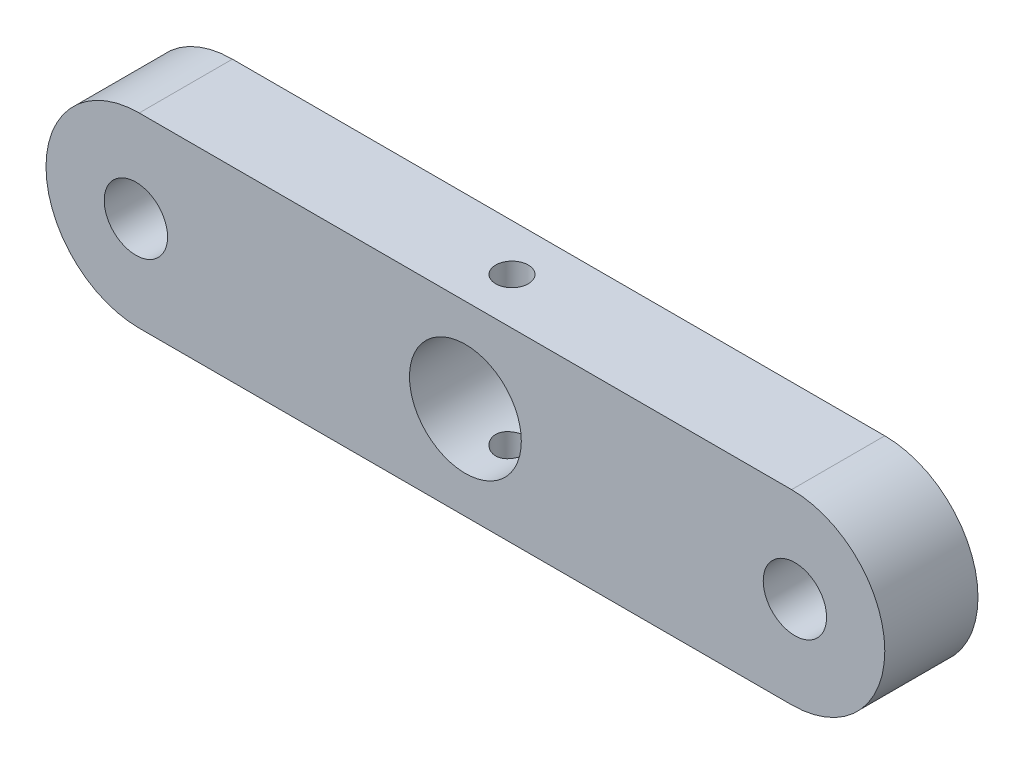
ISO-10303-21;
HEADER;
FILE_DESCRIPTION(('STEP AP214'),'2;1');
FILE_NAME('part.step','',(''),(''),'','','');
FILE_SCHEMA(('AUTOMOTIVE_DESIGN { 1 0 10303 214 1 1 1 1 }'));
ENDSEC;
DATA;
#1=APPLICATION_CONTEXT('core data for automotive mechanical design processes');
#2=APPLICATION_PROTOCOL_DEFINITION('international standard','automotive_design',2000,#1);
#3=PRODUCT_CONTEXT('',#1,'mechanical');
#4=PRODUCT('Part','Part','',(#3));
#5=PRODUCT_RELATED_PRODUCT_CATEGORY('part','',(#4));
#6=PRODUCT_DEFINITION_FORMATION('','',#4);
#7=PRODUCT_DEFINITION_CONTEXT('part definition',#1,'design');
#8=PRODUCT_DEFINITION('design','',#6,#7);
#9=PRODUCT_DEFINITION_SHAPE('','',#8);
#10=(LENGTH_UNIT() NAMED_UNIT(*) SI_UNIT(.MILLI.,.METRE.));
#11=(NAMED_UNIT(*) PLANE_ANGLE_UNIT() SI_UNIT($,.RADIAN.));
#12=(NAMED_UNIT(*) SI_UNIT($,.STERADIAN.) SOLID_ANGLE_UNIT());
#13=UNCERTAINTY_MEASURE_WITH_UNIT(LENGTH_MEASURE(1.E-05),#10,'distance_accuracy_value','');
#14=(GEOMETRIC_REPRESENTATION_CONTEXT(3) GLOBAL_UNCERTAINTY_ASSIGNED_CONTEXT((#13)) GLOBAL_UNIT_ASSIGNED_CONTEXT((#10,
#11,#12)) REPRESENTATION_CONTEXT('',''));
#15=CARTESIAN_POINT('',(0.,0.,0.));
#16=DIRECTION('',(0.,0.,1.));
#17=DIRECTION('',(1.,0.,0.));
#18=AXIS2_PLACEMENT_3D('',#15,#16,#17);
#19=CARTESIAN_POINT('',(-35.,0.,10.));
#20=DIRECTION('',(0.,0.,1.));
#21=DIRECTION('',(1.,0.,0.));
#22=AXIS2_PLACEMENT_3D('',#19,#20,#21);
#23=PLANE('',#22);
#24=CARTESIAN_POINT('',(0.,0.,10.));
#25=DIRECTION('',(0.,0.,1.));
#26=DIRECTION('',(1.,0.,0.));
#27=AXIS2_PLACEMENT_3D('',#24,#25,#26);
#28=CIRCLE('',#27,6.);
#29=CARTESIAN_POINT('',(6.00000000000002,0.,10.));
#30=VERTEX_POINT('',#29);
#31=EDGE_CURVE('E197',#30,#30,#28,.T.);
#32=ORIENTED_EDGE('',*,*,#31,.F.);
#33=EDGE_LOOP('',(#32));
#34=FACE_BOUND('',#33,.T.);
#35=CARTESIAN_POINT('',(-35.,0.,10.));
#36=DIRECTION('',(0.,0.,1.));
#37=DIRECTION('',(1.,0.,0.));
#38=AXIS2_PLACEMENT_3D('',#35,#36,#37);
#39=CIRCLE('',#38,10.);
#40=CARTESIAN_POINT('',(-35.,10.,10.));
#41=VERTEX_POINT('',#40);
#42=CARTESIAN_POINT('',(-35.,-9.99999999999999,10.));
#43=VERTEX_POINT('',#42);
#44=EDGE_CURVE('E99',#41,#43,#39,.T.);
#45=ORIENTED_EDGE('',*,*,#44,.T.);
#46=DIRECTION('',(1.,0.,0.));
#47=VECTOR('',#46,1.);
#48=CARTESIAN_POINT('',(-35.,-9.99999999999999,10.));
#49=LINE('',#48,#47);
#50=CARTESIAN_POINT('',(35.,-9.99999999999999,10.));
#51=VERTEX_POINT('',#50);
#52=EDGE_CURVE('E94',#43,#51,#49,.T.);
#53=ORIENTED_EDGE('',*,*,#52,.T.);
#54=CARTESIAN_POINT('',(35.,0.,10.));
#55=DIRECTION('',(0.,0.,1.));
#56=DIRECTION('',(1.,0.,0.));
#57=AXIS2_PLACEMENT_3D('',#54,#55,#56);
#58=CIRCLE('',#57,10.);
#59=CARTESIAN_POINT('',(35.,10.,10.));
#60=VERTEX_POINT('',#59);
#61=EDGE_CURVE('E97',#51,#60,#58,.T.);
#62=ORIENTED_EDGE('',*,*,#61,.T.);
#63=DIRECTION('',(-1.,0.,0.));
#64=VECTOR('',#63,1.);
#65=CARTESIAN_POINT('',(-35.,10.,10.));
#66=LINE('',#65,#64);
#67=EDGE_CURVE('E64',#60,#41,#66,.T.);
#68=ORIENTED_EDGE('',*,*,#67,.T.);
#69=EDGE_LOOP('',(#45,#53,#62,#68));
#70=FACE_BOUND('',#69,.T.);
#71=CARTESIAN_POINT('',(-35.355,0.,10.));
#72=DIRECTION('',(0.,0.,1.));
#73=DIRECTION('',(1.,0.,0.));
#74=AXIS2_PLACEMENT_3D('',#71,#72,#73);
#75=CIRCLE('',#74,3.4);
#76=CARTESIAN_POINT('',(-31.955,0.,10.));
#77=VERTEX_POINT('',#76);
#78=EDGE_CURVE('E120',#77,#77,#75,.T.);
#79=ORIENTED_EDGE('',*,*,#78,.F.);
#80=EDGE_LOOP('',(#79));
#81=FACE_BOUND('',#80,.T.);
#82=CARTESIAN_POINT('',(35.355,0.,10.));
#83=DIRECTION('',(0.,0.,1.));
#84=DIRECTION('',(-1.,0.,0.));
#85=AXIS2_PLACEMENT_3D('',#82,#83,#84);
#86=CIRCLE('',#85,3.4);
#87=CARTESIAN_POINT('',(31.955,0.,10.));
#88=VERTEX_POINT('',#87);
#89=EDGE_CURVE('E189',#88,#88,#86,.T.);
#90=ORIENTED_EDGE('',*,*,#89,.F.);
#91=EDGE_LOOP('',(#90));
#92=FACE_BOUND('',#91,.T.);
#93=ADVANCED_FACE('F39',(#34,#70,#81,#92),#23,.T.);
#94=CARTESIAN_POINT('',(-35.,0.,0.));
#95=DIRECTION('',(0.,0.,1.));
#96=DIRECTION('',(1.,0.,0.));
#97=AXIS2_PLACEMENT_3D('',#94,#95,#96);
#98=PLANE('',#97);
#99=CARTESIAN_POINT('',(-35.,0.,0.));
#100=DIRECTION('',(0.,0.,1.));
#101=DIRECTION('',(1.,0.,0.));
#102=AXIS2_PLACEMENT_3D('',#99,#100,#101);
#103=CIRCLE('',#102,10.);
#104=CARTESIAN_POINT('',(-35.,10.,0.));
#105=VERTEX_POINT('',#104);
#106=CARTESIAN_POINT('',(-35.,-9.99999999999999,0.));
#107=VERTEX_POINT('',#106);
#108=EDGE_CURVE('E116',#105,#107,#103,.T.);
#109=ORIENTED_EDGE('',*,*,#108,.F.);
#110=DIRECTION('',(-1.,0.,0.));
#111=VECTOR('',#110,1.);
#112=CARTESIAN_POINT('',(-35.,10.,0.));
#113=LINE('',#112,#111);
#114=CARTESIAN_POINT('',(35.,10.,0.));
#115=VERTEX_POINT('',#114);
#116=EDGE_CURVE('E87',#115,#105,#113,.T.);
#117=ORIENTED_EDGE('',*,*,#116,.F.);
#118=CARTESIAN_POINT('',(35.,0.,0.));
#119=DIRECTION('',(0.,0.,1.));
#120=DIRECTION('',(1.,0.,0.));
#121=AXIS2_PLACEMENT_3D('',#118,#119,#120);
#122=CIRCLE('',#121,10.);
#123=CARTESIAN_POINT('',(35.,-9.99999999999999,0.));
#124=VERTEX_POINT('',#123);
#125=EDGE_CURVE('E81',#124,#115,#122,.T.);
#126=ORIENTED_EDGE('',*,*,#125,.F.);
#127=DIRECTION('',(1.,0.,0.));
#128=VECTOR('',#127,1.);
#129=CARTESIAN_POINT('',(-35.,-9.99999999999999,0.));
#130=LINE('',#129,#128);
#131=EDGE_CURVE('E104',#107,#124,#130,.T.);
#132=ORIENTED_EDGE('',*,*,#131,.F.);
#133=EDGE_LOOP('',(#109,#117,#126,#132));
#134=FACE_BOUND('',#133,.T.);
#135=CARTESIAN_POINT('',(-35.355,0.,0.));
#136=DIRECTION('',(0.,0.,1.));
#137=DIRECTION('',(1.,0.,0.));
#138=AXIS2_PLACEMENT_3D('',#135,#136,#137);
#139=CIRCLE('',#138,3.4);
#140=CARTESIAN_POINT('',(-31.955,0.,0.));
#141=VERTEX_POINT('',#140);
#142=EDGE_CURVE('E201',#141,#141,#139,.T.);
#143=ORIENTED_EDGE('',*,*,#142,.T.);
#144=EDGE_LOOP('',(#143));
#145=FACE_BOUND('',#144,.T.);
#146=CARTESIAN_POINT('',(0.,0.,0.));
#147=DIRECTION('',(0.,0.,1.));
#148=DIRECTION('',(1.,0.,0.));
#149=AXIS2_PLACEMENT_3D('',#146,#147,#148);
#150=CIRCLE('',#149,6.);
#151=CARTESIAN_POINT('',(6.00000000000002,0.,0.));
#152=VERTEX_POINT('',#151);
#153=EDGE_CURVE('E192',#152,#152,#150,.T.);
#154=ORIENTED_EDGE('',*,*,#153,.T.);
#155=EDGE_LOOP('',(#154));
#156=FACE_BOUND('',#155,.T.);
#157=CARTESIAN_POINT('',(35.355,0.,0.));
#158=DIRECTION('',(0.,0.,1.));
#159=DIRECTION('',(-1.,0.,0.));
#160=AXIS2_PLACEMENT_3D('',#157,#158,#159);
#161=CIRCLE('',#160,3.4);
#162=CARTESIAN_POINT('',(31.955,0.,0.));
#163=VERTEX_POINT('',#162);
#164=EDGE_CURVE('E193',#163,#163,#161,.T.);
#165=ORIENTED_EDGE('',*,*,#164,.T.);
#166=EDGE_LOOP('',(#165));
#167=FACE_BOUND('',#166,.T.);
#168=ADVANCED_FACE('F158',(#134,#145,#156,#167),#98,.F.);
#169=CARTESIAN_POINT('',(-35.,0.,10.));
#170=DIRECTION('',(0.,0.,-1.));
#171=DIRECTION('',(-1.,0.,0.));
#172=AXIS2_PLACEMENT_3D('',#169,#170,#171);
#173=CYLINDRICAL_SURFACE('',#172,10.);
#174=ORIENTED_EDGE('',*,*,#108,.T.);
#175=DIRECTION('',(0.,0.,-1.));
#176=VECTOR('',#175,1.);
#177=CARTESIAN_POINT('',(-35.,-9.99999999999999,10.));
#178=LINE('',#177,#176);
#179=EDGE_CURVE('E11',#43,#107,#178,.T.);
#180=ORIENTED_EDGE('',*,*,#179,.F.);
#181=ORIENTED_EDGE('',*,*,#44,.F.);
#182=DIRECTION('',(0.,0.,-1.));
#183=VECTOR('',#182,1.);
#184=CARTESIAN_POINT('',(-35.,10.,10.));
#185=LINE('',#184,#183);
#186=EDGE_CURVE('E112',#41,#105,#185,.T.);
#187=ORIENTED_EDGE('',*,*,#186,.T.);
#188=EDGE_LOOP('',(#174,#180,#181,#187));
#189=FACE_BOUND('',#188,.T.);
#190=ADVANCED_FACE('F41',(#189),#173,.T.);
#191=CARTESIAN_POINT('',(-35.,-9.99999999999999,10.));
#192=DIRECTION('',(0.,1.,0.));
#193=DIRECTION('',(0.,0.,1.));
#194=AXIS2_PLACEMENT_3D('',#191,#192,#193);
#195=PLANE('',#194);
#196=CARTESIAN_POINT('',(0.,-10.,4.99999999999993));
#197=DIRECTION('',(0.,1.,0.));
#198=DIRECTION('',(0.,0.,1.));
#199=AXIS2_PLACEMENT_3D('',#196,#197,#198);
#200=CIRCLE('',#199,1.75);
#201=CARTESIAN_POINT('',(0.,-10.,6.74999999999992));
#202=VERTEX_POINT('',#201);
#203=EDGE_CURVE('E136',#202,#202,#200,.T.);
#204=ORIENTED_EDGE('',*,*,#203,.T.);
#205=EDGE_LOOP('',(#204));
#206=FACE_BOUND('',#205,.T.);
#207=ORIENTED_EDGE('',*,*,#131,.T.);
#208=DIRECTION('',(0.,0.,-1.));
#209=VECTOR('',#208,1.);
#210=CARTESIAN_POINT('',(35.,-9.99999999999999,10.));
#211=LINE('',#210,#209);
#212=EDGE_CURVE('E55',#51,#124,#211,.T.);
#213=ORIENTED_EDGE('',*,*,#212,.F.);
#214=ORIENTED_EDGE('',*,*,#52,.F.);
#215=ORIENTED_EDGE('',*,*,#179,.T.);
#216=EDGE_LOOP('',(#207,#213,#214,#215));
#217=FACE_BOUND('',#216,.T.);
#218=ADVANCED_FACE('F103',(#206,#217),#195,.F.);
#219=CARTESIAN_POINT('',(35.,0.,10.));
#220=DIRECTION('',(0.,0.,-1.));
#221=DIRECTION('',(-1.,0.,0.));
#222=AXIS2_PLACEMENT_3D('',#219,#220,#221);
#223=CYLINDRICAL_SURFACE('',#222,10.);
#224=ORIENTED_EDGE('',*,*,#125,.T.);
#225=DIRECTION('',(0.,0.,-1.));
#226=VECTOR('',#225,1.);
#227=CARTESIAN_POINT('',(35.,10.,10.));
#228=LINE('',#227,#226);
#229=EDGE_CURVE('E106',#60,#115,#228,.T.);
#230=ORIENTED_EDGE('',*,*,#229,.F.);
#231=ORIENTED_EDGE('',*,*,#61,.F.);
#232=ORIENTED_EDGE('',*,*,#212,.T.);
#233=EDGE_LOOP('',(#224,#230,#231,#232));
#234=FACE_BOUND('',#233,.T.);
#235=ADVANCED_FACE('F108',(#234),#223,.T.);
#236=CARTESIAN_POINT('',(-35.,10.,10.));
#237=DIRECTION('',(0.,-1.,0.));
#238=DIRECTION('',(0.,0.,-1.));
#239=AXIS2_PLACEMENT_3D('',#236,#237,#238);
#240=PLANE('',#239);
#241=CARTESIAN_POINT('',(0.,10.,4.99999999999993));
#242=DIRECTION('',(0.,1.,0.));
#243=DIRECTION('',(0.,0.,1.));
#244=AXIS2_PLACEMENT_3D('',#241,#242,#243);
#245=CIRCLE('',#244,1.75);
#246=CARTESIAN_POINT('',(0.,10.,6.74999999999992));
#247=VERTEX_POINT('',#246);
#248=EDGE_CURVE('E183',#247,#247,#245,.T.);
#249=ORIENTED_EDGE('',*,*,#248,.F.);
#250=EDGE_LOOP('',(#249));
#251=FACE_BOUND('',#250,.T.);
#252=ORIENTED_EDGE('',*,*,#116,.T.);
#253=ORIENTED_EDGE('',*,*,#186,.F.);
#254=ORIENTED_EDGE('',*,*,#67,.F.);
#255=ORIENTED_EDGE('',*,*,#229,.T.);
#256=EDGE_LOOP('',(#252,#253,#254,#255));
#257=FACE_BOUND('',#256,.T.);
#258=ADVANCED_FACE('F168',(#251,#257),#240,.F.);
#259=CARTESIAN_POINT('',(-35.355,0.,10.));
#260=DIRECTION('',(0.,0.,-1.));
#261=DIRECTION('',(-1.,0.,0.));
#262=AXIS2_PLACEMENT_3D('',#259,#260,#261);
#263=CYLINDRICAL_SURFACE('',#262,3.4);
#264=ORIENTED_EDGE('',*,*,#78,.T.);
#265=EDGE_LOOP('',(#264));
#266=FACE_BOUND('',#265,.T.);
#267=ORIENTED_EDGE('',*,*,#142,.F.);
#268=EDGE_LOOP('',(#267));
#269=FACE_BOUND('',#268,.T.);
#270=ADVANCED_FACE('F153',(#266,#269),#263,.F.);
#271=CARTESIAN_POINT('',(0.,0.,10.));
#272=DIRECTION('',(0.,0.,-1.));
#273=DIRECTION('',(-1.,0.,0.));
#274=AXIS2_PLACEMENT_3D('',#271,#272,#273);
#275=CYLINDRICAL_SURFACE('',#274,6.);
#276=CARTESIAN_POINT('',(0.,-5.99999999999999,6.74999999999992));
#277=CARTESIAN_POINT('',(0.0961253080181352,-5.99999897932778,6.74999851514788));
#278=CARTESIAN_POINT('',(0.192265738977875,-5.99766772555916,6.74205359001823));
#279=CARTESIAN_POINT('',(0.381754666118445,-5.98859526937579,6.71055420393166));
#280=CARTESIAN_POINT('',(0.475102186570464,-5.98185254415877,6.68699435279903));
#281=CARTESIAN_POINT('',(0.656244329270382,-5.96469737869574,6.62511299381737));
#282=CARTESIAN_POINT('',(0.744046672462424,-5.95429017982355,6.58681256248934));
#283=CARTESIAN_POINT('',(0.911982923632396,-5.93089244308037,6.49662155840004));
#284=CARTESIAN_POINT('',(0.992115936834366,-5.91790160432062,6.44472940253338));
#285=CARTESIAN_POINT('',(1.14462561886912,-5.89033024399657,6.3273349841869));
#286=CARTESIAN_POINT('',(1.21676335643119,-5.87571850769828,6.26152966416684));
#287=CARTESIAN_POINT('',(1.34915166645238,-5.84674198910841,6.1188232710067));
#288=CARTESIAN_POINT('',(1.40940036887666,-5.83237724599042,6.04192045562182));
#289=CARTESIAN_POINT('',(1.51753336674037,-5.80519383512121,5.87721033286057));
#290=CARTESIAN_POINT('',(1.56513041604444,-5.79241411758615,5.78920741823362));
#291=CARTESIAN_POINT('',(1.64475391362963,-5.7703123169837,5.6060139235982));
#292=CARTESIAN_POINT('',(1.67678387060038,-5.76098945488303,5.51082496885509));
#293=CARTESIAN_POINT('',(1.72351063083405,-5.74718144308774,5.31863537029759));
#294=CARTESIAN_POINT('',(1.73864609017391,-5.74257413524905,5.22175038253506));
#295=CARTESIAN_POINT('',(1.75252346344242,-5.73835505823415,5.02671520858583));
#296=CARTESIAN_POINT('',(1.75126910635538,-5.73874215273942,4.92856531526504));
#297=CARTESIAN_POINT('',(1.73274795276527,-5.74435959682319,4.73731524540817));
#298=CARTESIAN_POINT('',(1.71602568393069,-5.74942523520474,4.64415670470317));
#299=CARTESIAN_POINT('',(1.66792117497863,-5.76356324195848,4.46202918903917));
#300=CARTESIAN_POINT('',(1.63653755962283,-5.77263598619394,4.37306060796151));
#301=CARTESIAN_POINT('',(1.55958925270797,-5.79390080921967,4.20048400801904));
#302=CARTESIAN_POINT('',(1.51384428393233,-5.80613217077637,4.11696141758592));
#303=CARTESIAN_POINT('',(1.40959719774949,-5.83231660479806,3.95859323240324));
#304=CARTESIAN_POINT('',(1.35109213587037,-5.84627007432715,3.88374964650443));
#305=CARTESIAN_POINT('',(1.22026040657198,-5.87499914138167,3.74176939696956));
#306=CARTESIAN_POINT('',(1.14748039837388,-5.88978548224527,3.67505196568471));
#307=CARTESIAN_POINT('',(0.991581308885597,-5.91802612754818,3.55467457984269));
#308=CARTESIAN_POINT('',(0.908461646345303,-5.9314803570256,3.50101535986273));
#309=CARTESIAN_POINT('',(0.733510271908769,-5.95565253423199,3.40804165565266));
#310=CARTESIAN_POINT('',(0.641629012196371,-5.96635347926388,3.36881569218862));
#311=CARTESIAN_POINT('',(0.452189927913559,-5.98369087780733,3.30649482914874));
#312=CARTESIAN_POINT('',(0.354633604003033,-5.99032840050987,3.28339568596666));
#313=CARTESIAN_POINT('',(0.160181198028378,-5.99862388766847,3.25467172956891));
#314=CARTESIAN_POINT('',(0.0633758944645875,-6.00044382600873,3.24847829102011));
#315=CARTESIAN_POINT('',(-0.129894955210873,-5.99937180655024,3.25215387818965));
#316=CARTESIAN_POINT('',(-0.226360542441065,-5.99648044012061,3.26202088797941));
#317=CARTESIAN_POINT('',(-0.414097830664112,-5.98641640064661,3.2970755868243));
#318=CARTESIAN_POINT('',(-0.505436223327997,-5.97933553979801,3.32193493989786));
#319=CARTESIAN_POINT('',(-0.6826291039212,-5.96170716095042,3.38587721933097));
#320=CARTESIAN_POINT('',(-0.768482945307057,-5.95115923513568,3.42496181900241));
#321=CARTESIAN_POINT('',(-0.934392573124851,-5.92740206937565,3.5172253379229));
#322=CARTESIAN_POINT('',(-1.01427661269997,-5.91413878305624,3.5706988109493));
#323=CARTESIAN_POINT('',(-1.16413296084877,-5.88647695237989,3.6898611492151));
#324=CARTESIAN_POINT('',(-1.23410291257553,-5.87207813933965,3.7555529105171));
#325=CARTESIAN_POINT('',(-1.36462158583737,-5.84315282434342,3.89995535038962));
#326=CARTESIAN_POINT('',(-1.42476642228299,-5.82863878716343,3.97903434380815));
#327=CARTESIAN_POINT('',(-1.5309555158763,-5.80165389300296,4.14647697273476));
#328=CARTESIAN_POINT('',(-1.57700021873977,-5.78918297144386,4.234840314639));
#329=CARTESIAN_POINT('',(-1.65335355571835,-5.76784149110913,4.41800906834089));
#330=CARTESIAN_POINT('',(-1.68374186549711,-5.75895275395433,4.51277902915975));
#331=CARTESIAN_POINT('',(-1.7280482208509,-5.7458153184576,4.70639550313215));
#332=CARTESIAN_POINT('',(-1.74197152209895,-5.74156513950939,4.80524070502682));
#333=CARTESIAN_POINT('',(-1.75260895170655,-5.73832630544295,5.00002254118173));
#334=CARTESIAN_POINT('',(-1.74997891215048,-5.73913712613565,5.09592050986427));
#335=CARTESIAN_POINT('',(-1.72913831847244,-5.74545008197208,5.28584289285397));
#336=CARTESIAN_POINT('',(-1.71092832593949,-5.75095204802056,5.37986737456712));
#337=CARTESIAN_POINT('',(-1.65985748033916,-5.76589662443702,5.56236618301309));
#338=CARTESIAN_POINT('',(-1.62716125079618,-5.7752948817854,5.65089047540513));
#339=CARTESIAN_POINT('',(-1.54817363617336,-5.79696714255005,5.82126724612178));
#340=CARTESIAN_POINT('',(-1.50187976224371,-5.80924167234267,5.90311849953723));
#341=CARTESIAN_POINT('',(-1.39513128146527,-5.83581435741764,6.06089207023759));
#342=CARTESIAN_POINT('',(-1.33424162455882,-5.85016789019054,6.13651071754174));
#343=CARTESIAN_POINT('',(-1.20082452655383,-5.87900256664696,6.27666967580492));
#344=CARTESIAN_POINT('',(-1.12829412203371,-5.8934837419353,6.34120715711439));
#345=CARTESIAN_POINT('',(-0.971285174602809,-5.92141239923086,6.459109531477));
#346=CARTESIAN_POINT('',(-0.886536063614253,-5.93482122382386,6.51212417614994));
#347=CARTESIAN_POINT('',(-0.708936452074231,-5.95864200095582,6.60307524955477));
#348=CARTESIAN_POINT('',(-0.61609014933606,-5.96905549446414,6.64101943523139));
#349=CARTESIAN_POINT('',(-0.436605177870391,-5.98468728404806,6.69694094930784));
#350=CARTESIAN_POINT('',(-0.350586197050688,-5.99038360588642,6.71678627055821));
#351=CARTESIAN_POINT('',(-0.176382174555846,-5.99804015775584,6.74331551061325));
#352=CARTESIAN_POINT('',(-0.088197452929694,-6.00000093649312,6.75000136239002));
#353=CARTESIAN_POINT('',(0.,-5.99999999999999,6.74999999999992));
#354=B_SPLINE_CURVE_WITH_KNOTS('',3,(#276,#277,#278,#279,#280,#281,#282,#283,#284,#285,#286,
#287,#288,#289,#290,#291,#292,#293,#294,#295,#296,#297,#298,#299,#300,#301,#302,#303,#304,#305,
#306,#307,#308,#309,#310,#311,#312,#313,#314,#315,#316,#317,#318,#319,#320,#321,#322,#323,#324,
#325,#326,#327,#328,#329,#330,#331,#332,#333,#334,#335,#336,#337,#338,#339,#340,#341,#342,#343,
#344,#345,#346,#347,#348,#349,#350,#351,#352,#353),.UNSPECIFIED.,.T.,.F.,(4,2,2,2,2,2,2,2,2,2,2,
2,2,2,2,2,2,2,2,2,2,2,2,2,2,2,2,2,2,2,2,2,2,2,2,2,2,2,4),(0.,0.288052093618848,
0.576203672859807,0.863944765925736,1.15171938874705,1.4465642107671,1.74145537223885,
2.0425595140536,2.34359575805743,2.63661948180926,2.92957653844227,3.21259753810651,
3.49564509054992,3.78239825352143,4.06921765673403,4.36732499534253,4.66544909982039,
4.96537230276012,5.26521655422945,5.55484346037065,5.84443401496553,6.12790175562712,
6.41140285130436,6.70121883369903,6.99110359801334,7.29089914342064,7.59068521108747,
7.88893020644376,8.18707997551209,8.47349366019239,8.75989702134951,9.04312596000904,
9.32640677192023,9.61950228446205,9.91267252994438,10.2137891731666,10.5147506265853,
10.7790846930659,11.0433799290662),.UNSPECIFIED.);
#355=CARTESIAN_POINT('',(0.,-5.99999999999999,6.74999999999992));
#356=VERTEX_POINT('',#355);
#357=EDGE_CURVE('E43',#356,#356,#354,.T.);
#358=ORIENTED_EDGE('',*,*,#357,.F.);
#359=EDGE_LOOP('',(#358));
#360=FACE_BOUND('',#359,.T.);
#361=CARTESIAN_POINT('',(0.,6.00000000000001,6.74999999999992));
#362=CARTESIAN_POINT('',(-0.0961253080181353,5.99999897932779,6.74999851514788));
#363=CARTESIAN_POINT('',(-0.192265738977875,5.99766772555917,6.74205359001823));
#364=CARTESIAN_POINT('',(-0.381754666118445,5.9885952693758,6.71055420393166));
#365=CARTESIAN_POINT('',(-0.475102186570464,5.98185254415878,6.68699435279903));
#366=CARTESIAN_POINT('',(-0.656244329270382,5.96469737869575,6.62511299381737));
#367=CARTESIAN_POINT('',(-0.744046672462424,5.95429017982356,6.58681256248934));
#368=CARTESIAN_POINT('',(-0.911982923632396,5.93089244308038,6.49662155840004));
#369=CARTESIAN_POINT('',(-0.992115936834366,5.91790160432063,6.44472940253338));
#370=CARTESIAN_POINT('',(-1.14462561886912,5.89033024399658,6.3273349841869));
#371=CARTESIAN_POINT('',(-1.21676335643119,5.87571850769828,6.26152966416684));
#372=CARTESIAN_POINT('',(-1.34915166645238,5.84674198910841,6.1188232710067));
#373=CARTESIAN_POINT('',(-1.40940036887666,5.83237724599043,6.04192045562182));
#374=CARTESIAN_POINT('',(-1.51753336674037,5.80519383512122,5.87721033286057));
#375=CARTESIAN_POINT('',(-1.56513041604444,5.79241411758616,5.78920741823362));
#376=CARTESIAN_POINT('',(-1.64475391362963,5.7703123169837,5.6060139235982));
#377=CARTESIAN_POINT('',(-1.67678387060038,5.76098945488303,5.51082496885509));
#378=CARTESIAN_POINT('',(-1.72351063083405,5.74718144308775,5.31863537029759));
#379=CARTESIAN_POINT('',(-1.73864609017391,5.74257413524905,5.22175038253506));
#380=CARTESIAN_POINT('',(-1.75252346344242,5.73835505823415,5.02671520858583));
#381=CARTESIAN_POINT('',(-1.75126910635538,5.73874215273942,4.92856531526504));
#382=CARTESIAN_POINT('',(-1.73274795276527,5.74435959682319,4.73731524540817));
#383=CARTESIAN_POINT('',(-1.71602568393069,5.74942523520474,4.64415670470317));
#384=CARTESIAN_POINT('',(-1.66792117497863,5.76356324195849,4.46202918903917));
#385=CARTESIAN_POINT('',(-1.63653755962283,5.77263598619395,4.3730606079615));
#386=CARTESIAN_POINT('',(-1.55958925270797,5.79390080921968,4.20048400801904));
#387=CARTESIAN_POINT('',(-1.51384428393233,5.80613217077638,4.11696141758592));
#388=CARTESIAN_POINT('',(-1.40959719774949,5.83231660479807,3.95859323240324));
#389=CARTESIAN_POINT('',(-1.35109213587037,5.84627007432716,3.88374964650443));
#390=CARTESIAN_POINT('',(-1.22026040657198,5.87499914138168,3.74176939696956));
#391=CARTESIAN_POINT('',(-1.14748039837388,5.88978548224528,3.67505196568471));
#392=CARTESIAN_POINT('',(-0.991581308885598,5.91802612754819,3.55467457984269));
#393=CARTESIAN_POINT('',(-0.908461646345304,5.93148035702561,3.50101535986274));
#394=CARTESIAN_POINT('',(-0.733510271908771,5.955652534232,3.40804165565266));
#395=CARTESIAN_POINT('',(-0.641629012196372,5.96635347926389,3.36881569218862));
#396=CARTESIAN_POINT('',(-0.452189927913561,5.98369087780734,3.30649482914874));
#397=CARTESIAN_POINT('',(-0.354633604003034,5.99032840050989,3.28339568596666));
#398=CARTESIAN_POINT('',(-0.160181198028379,5.99862388766848,3.25467172956891));
#399=CARTESIAN_POINT('',(-0.0633758944645877,6.00044382600874,3.24847829102011));
#400=CARTESIAN_POINT('',(0.129894955210873,5.99937180655026,3.25215387818965));
#401=CARTESIAN_POINT('',(0.226360542441065,5.99648044012063,3.26202088797941));
#402=CARTESIAN_POINT('',(0.414097830664113,5.98641640064663,3.2970755868243));
#403=CARTESIAN_POINT('',(0.505436223327997,5.97933553979802,3.32193493989786));
#404=CARTESIAN_POINT('',(0.6826291039212,5.96170716095043,3.38587721933097));
#405=CARTESIAN_POINT('',(0.768482945307058,5.95115923513569,3.42496181900241));
#406=CARTESIAN_POINT('',(0.934392573124851,5.92740206937567,3.5172253379229));
#407=CARTESIAN_POINT('',(1.01427661269997,5.91413878305626,3.5706988109493));
#408=CARTESIAN_POINT('',(1.16413296084877,5.88647695237991,3.6898611492151));
#409=CARTESIAN_POINT('',(1.23410291257553,5.87207813933967,3.7555529105171));
#410=CARTESIAN_POINT('',(1.36462158583737,5.84315282434343,3.89995535038962));
#411=CARTESIAN_POINT('',(1.42476642228299,5.82863878716345,3.97903434380816));
#412=CARTESIAN_POINT('',(1.5309555158763,5.80165389300298,4.14647697273476));
#413=CARTESIAN_POINT('',(1.57700021873977,5.78918297144388,4.234840314639));
#414=CARTESIAN_POINT('',(1.65335355571834,5.76784149110915,4.41800906834089));
#415=CARTESIAN_POINT('',(1.68374186549711,5.75895275395435,4.51277902915974));
#416=CARTESIAN_POINT('',(1.7280482208509,5.74581531845762,4.70639550313215));
#417=CARTESIAN_POINT('',(1.74197152209895,5.74156513950942,4.80524070502682));
#418=CARTESIAN_POINT('',(1.75260895170655,5.73832630544298,5.00002254118173));
#419=CARTESIAN_POINT('',(1.74997891215048,5.73913712613567,5.09592050986427));
#420=CARTESIAN_POINT('',(1.72913831847244,5.7454500819721,5.28584289285397));
#421=CARTESIAN_POINT('',(1.71092832593949,5.75095204802058,5.37986737456712));
#422=CARTESIAN_POINT('',(1.65985748033916,5.76589662443704,5.56236618301309));
#423=CARTESIAN_POINT('',(1.62716125079618,5.77529488178542,5.65089047540513));
#424=CARTESIAN_POINT('',(1.54817363617336,5.79696714255008,5.82126724612178));
#425=CARTESIAN_POINT('',(1.50187976224371,5.80924167234269,5.90311849953723));
#426=CARTESIAN_POINT('',(1.39513128146527,5.83581435741766,6.06089207023759));
#427=CARTESIAN_POINT('',(1.33424162455882,5.85016789019056,6.13651071754174));
#428=CARTESIAN_POINT('',(1.20082452655382,5.87900256664698,6.27666967580492));
#429=CARTESIAN_POINT('',(1.1282941220337,5.89348374193532,6.34120715711439));
#430=CARTESIAN_POINT('',(0.971285174602807,5.92141239923088,6.459109531477));
#431=CARTESIAN_POINT('',(0.88653606361425,5.93482122382388,6.51212417614994));
#432=CARTESIAN_POINT('',(0.708936452074228,5.95864200095584,6.60307524955477));
#433=CARTESIAN_POINT('',(0.616090149336057,5.96905549446416,6.64101943523139));
#434=CARTESIAN_POINT('',(0.43660517787039,5.98468728404807,6.69694094930784));
#435=CARTESIAN_POINT('',(0.350586197050687,5.99038360588643,6.71678627055821));
#436=CARTESIAN_POINT('',(0.176382174555846,5.99804015775585,6.74331551061325));
#437=CARTESIAN_POINT('',(0.0881974529296939,6.00000093649313,6.75000136239002));
#438=CARTESIAN_POINT('',(0.,6.00000000000001,6.74999999999992));
#439=B_SPLINE_CURVE_WITH_KNOTS('',3,(#361,#362,#363,#364,#365,#366,#367,#368,#369,#370,#371,
#372,#373,#374,#375,#376,#377,#378,#379,#380,#381,#382,#383,#384,#385,#386,#387,#388,#389,#390,
#391,#392,#393,#394,#395,#396,#397,#398,#399,#400,#401,#402,#403,#404,#405,#406,#407,#408,#409,
#410,#411,#412,#413,#414,#415,#416,#417,#418,#419,#420,#421,#422,#423,#424,#425,#426,#427,#428,
#429,#430,#431,#432,#433,#434,#435,#436,#437,#438),.UNSPECIFIED.,.T.,.F.,(4,2,2,2,2,2,2,2,2,2,2,
2,2,2,2,2,2,2,2,2,2,2,2,2,2,2,2,2,2,2,2,2,2,2,2,2,2,2,4),(0.,0.288052093618848,
0.576203672859808,0.863944765925736,1.15171938874705,1.4465642107671,1.74145537223885,
2.0425595140536,2.34359575805743,2.63661948180926,2.92957653844227,3.21259753810652,
3.49564509054993,3.78239825352143,4.06921765673403,4.36732499534253,4.66544909982039,
4.96537230276012,5.26521655422945,5.55484346037065,5.84443401496553,6.12790175562712,
6.41140285130436,6.70121883369903,6.99110359801334,7.29089914342064,7.59068521108747,
7.88893020644376,8.18707997551209,8.47349366019239,8.75989702134951,9.04312596000904,
9.32640677192023,9.61950228446205,9.91267252994438,10.2137891731666,10.5147506265853,
10.7790846930659,11.0433799290662),.UNSPECIFIED.);
#440=CARTESIAN_POINT('',(0.,6.00000000000001,6.74999999999992));
#441=VERTEX_POINT('',#440);
#442=EDGE_CURVE('E130',#441,#441,#439,.T.);
#443=ORIENTED_EDGE('',*,*,#442,.F.);
#444=EDGE_LOOP('',(#443));
#445=FACE_BOUND('',#444,.T.);
#446=ORIENTED_EDGE('',*,*,#31,.T.);
#447=EDGE_LOOP('',(#446));
#448=FACE_BOUND('',#447,.T.);
#449=ORIENTED_EDGE('',*,*,#153,.F.);
#450=EDGE_LOOP('',(#449));
#451=FACE_BOUND('',#450,.T.);
#452=ADVANCED_FACE('F137',(#360,#445,#448,#451),#275,.F.);
#453=CARTESIAN_POINT('',(35.355,0.,10.));
#454=DIRECTION('',(0.,0.,-1.));
#455=DIRECTION('',(-1.,0.,0.));
#456=AXIS2_PLACEMENT_3D('',#453,#454,#455);
#457=CYLINDRICAL_SURFACE('',#456,3.4);
#458=ORIENTED_EDGE('',*,*,#89,.T.);
#459=EDGE_LOOP('',(#458));
#460=FACE_BOUND('',#459,.T.);
#461=ORIENTED_EDGE('',*,*,#164,.F.);
#462=EDGE_LOOP('',(#461));
#463=FACE_BOUND('',#462,.T.);
#464=ADVANCED_FACE('F145',(#460,#463),#457,.F.);
#465=CARTESIAN_POINT('',(0.,10.,4.99999999999993));
#466=DIRECTION('',(0.,1.,0.));
#467=DIRECTION('',(0.,0.,1.));
#468=AXIS2_PLACEMENT_3D('',#465,#466,#467);
#469=CYLINDRICAL_SURFACE('',#468,1.75);
#470=ORIENTED_EDGE('',*,*,#442,.T.);
#471=EDGE_LOOP('',(#470));
#472=FACE_BOUND('',#471,.T.);
#473=ORIENTED_EDGE('',*,*,#248,.T.);
#474=EDGE_LOOP('',(#473));
#475=FACE_BOUND('',#474,.T.);
#476=ADVANCED_FACE('F141',(#472,#475),#469,.F.);
#477=ORIENTED_EDGE('',*,*,#357,.T.);
#478=EDGE_LOOP('',(#477));
#479=FACE_BOUND('',#478,.T.);
#480=ORIENTED_EDGE('',*,*,#203,.F.);
#481=EDGE_LOOP('',(#480));
#482=FACE_BOUND('',#481,.T.);
#483=ADVANCED_FACE('F144',(#479,#482),#469,.F.);
#484=CLOSED_SHELL('',(#93,#168,#190,#218,#235,#258,#270,#452,#464,#476,#483));
#485=MANIFOLD_SOLID_BREP('B2',#484);
#486=ADVANCED_BREP_SHAPE_REPRESENTATION('',(#18,#485),#14);
#487=SHAPE_DEFINITION_REPRESENTATION(#9,#486);
ENDSEC;
END-ISO-10303-21;
